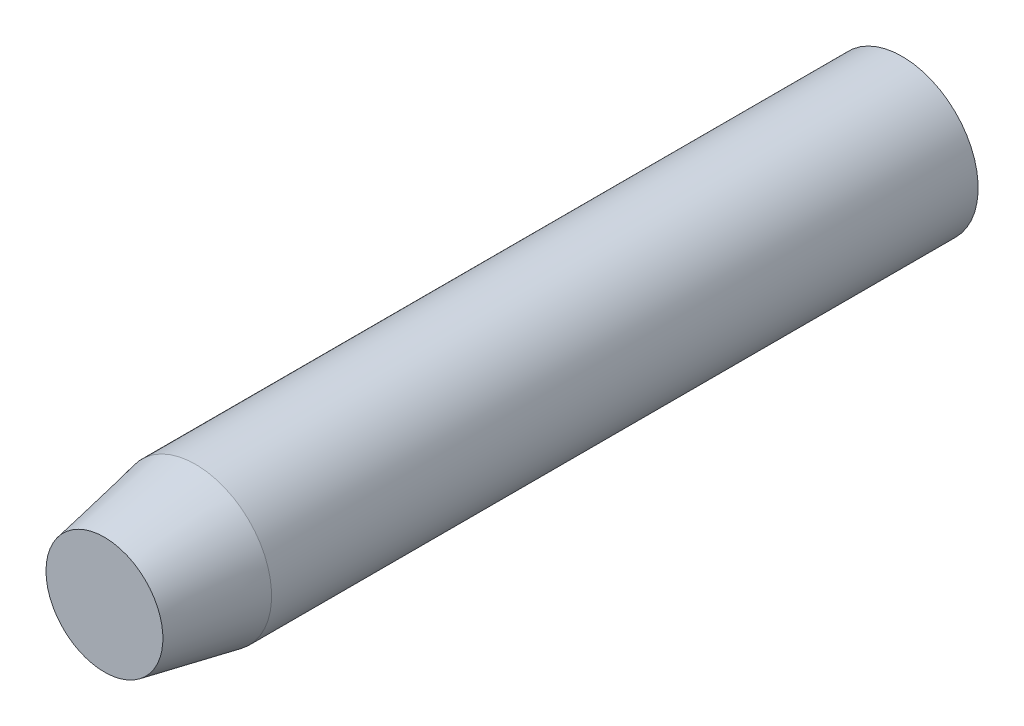
ISO-10303-21;
HEADER;
FILE_DESCRIPTION(('STEP AP214'),'2;1');
FILE_NAME('part.step','',(''),(''),'','','');
FILE_SCHEMA(('AUTOMOTIVE_DESIGN { 1 0 10303 214 1 1 1 1 }'));
ENDSEC;
DATA;
#1=APPLICATION_CONTEXT('core data for automotive mechanical design processes');
#2=APPLICATION_PROTOCOL_DEFINITION('international standard','automotive_design',2000,#1);
#3=PRODUCT_CONTEXT('',#1,'mechanical');
#4=PRODUCT('Part','Part','',(#3));
#5=PRODUCT_RELATED_PRODUCT_CATEGORY('part','',(#4));
#6=PRODUCT_DEFINITION_FORMATION('','',#4);
#7=PRODUCT_DEFINITION_CONTEXT('part definition',#1,'design');
#8=PRODUCT_DEFINITION('design','',#6,#7);
#9=PRODUCT_DEFINITION_SHAPE('','',#8);
#10=(LENGTH_UNIT() NAMED_UNIT(*) SI_UNIT(.MILLI.,.METRE.));
#11=(NAMED_UNIT(*) PLANE_ANGLE_UNIT() SI_UNIT($,.RADIAN.));
#12=(NAMED_UNIT(*) SI_UNIT($,.STERADIAN.) SOLID_ANGLE_UNIT());
#13=UNCERTAINTY_MEASURE_WITH_UNIT(LENGTH_MEASURE(1.E-05),#10,'distance_accuracy_value','');
#14=(GEOMETRIC_REPRESENTATION_CONTEXT(3) GLOBAL_UNCERTAINTY_ASSIGNED_CONTEXT((#13)) GLOBAL_UNIT_ASSIGNED_CONTEXT((#10,
#11,#12)) REPRESENTATION_CONTEXT('',''));
#15=CARTESIAN_POINT('',(0.,0.,0.));
#16=DIRECTION('',(0.,0.,1.));
#17=DIRECTION('',(1.,0.,0.));
#18=AXIS2_PLACEMENT_3D('',#15,#16,#17);
#19=CARTESIAN_POINT('',(-7.95,0.,-45.36875));
#20=DIRECTION('',(0.,0.,-1.));
#21=DIRECTION('',(-1.,0.,0.));
#22=AXIS2_PLACEMENT_3D('',#19,#20,#21);
#23=CYLINDRICAL_SURFACE('',#22,6.5);
#24=CARTESIAN_POINT('',(-7.94999999999999,0.,31.76875));
#25=DIRECTION('',(0.,0.,-1.));
#26=DIRECTION('',(-1.,0.,0.));
#27=AXIS2_PLACEMENT_3D('',#24,#25,#26);
#28=CIRCLE('',#27,6.5);
#29=CARTESIAN_POINT('',(-14.45,0.,31.76875));
#30=VERTEX_POINT('',#29);
#31=EDGE_CURVE('E10',#30,#30,#28,.T.);
#32=ORIENTED_EDGE('',*,*,#31,.T.);
#33=EDGE_LOOP('',(#32));
#34=FACE_BOUND('',#33,.T.);
#35=CARTESIAN_POINT('',(-7.95,0.,-28.68125));
#36=DIRECTION('',(0.,0.,-1.));
#37=DIRECTION('',(-1.,0.,0.));
#38=AXIS2_PLACEMENT_3D('',#35,#36,#37);
#39=CIRCLE('',#38,6.49999999999999);
#40=CARTESIAN_POINT('',(-14.45,0.,-28.68125));
#41=VERTEX_POINT('',#40);
#42=EDGE_CURVE('E52',#41,#41,#39,.T.);
#43=ORIENTED_EDGE('',*,*,#42,.F.);
#44=EDGE_LOOP('',(#43));
#45=FACE_BOUND('',#44,.T.);
#46=ADVANCED_FACE('F33',(#34,#45),#23,.T.);
#47=CARTESIAN_POINT('',(-7.94999999999999,0.,31.76875));
#48=DIRECTION('',(0.,0.,-1.));
#49=DIRECTION('',(-1.,0.,0.));
#50=AXIS2_PLACEMENT_3D('',#47,#48,#49);
#51=CONICAL_SURFACE('',#50,6.5,0.189988287918716);
#52=CARTESIAN_POINT('',(-7.94999999999999,0.,39.56875));
#53=DIRECTION('',(0.,0.,-1.));
#54=DIRECTION('',(-1.,0.,0.));
#55=AXIS2_PLACEMENT_3D('',#52,#53,#54);
#56=CIRCLE('',#55,5.);
#57=CARTESIAN_POINT('',(-12.95,0.,39.56875));
#58=VERTEX_POINT('',#57);
#59=EDGE_CURVE('E39',#58,#58,#56,.T.);
#60=ORIENTED_EDGE('',*,*,#59,.T.);
#61=EDGE_LOOP('',(#60));
#62=FACE_BOUND('',#61,.T.);
#63=ORIENTED_EDGE('',*,*,#31,.F.);
#64=EDGE_LOOP('',(#63));
#65=FACE_BOUND('',#64,.T.);
#66=ADVANCED_FACE('F60',(#62,#65),#51,.T.);
#67=CARTESIAN_POINT('',(-12.95,0.,39.56875));
#68=DIRECTION('',(0.,0.,1.));
#69=DIRECTION('',(1.,0.,0.));
#70=AXIS2_PLACEMENT_3D('',#67,#68,#69);
#71=PLANE('',#70);
#72=ORIENTED_EDGE('',*,*,#59,.F.);
#73=EDGE_LOOP('',(#72));
#74=FACE_BOUND('',#73,.T.);
#75=ADVANCED_FACE('F64',(#74),#71,.T.);
#76=CARTESIAN_POINT('',(-7.94999999999999,0.,32.0158815986255));
#77=DIRECTION('',(0.,0.,-1.));
#78=DIRECTION('',(-1.,0.,0.));
#79=AXIS2_PLACEMENT_3D('',#76,#77,#78);
#80=PLANE('',#79);
#81=CARTESIAN_POINT('',(-7.94999999999999,0.,32.0158815986254));
#82=DIRECTION('',(0.,0.,-1.));
#83=DIRECTION('',(-1.,0.,0.));
#84=AXIS2_PLACEMENT_3D('',#81,#82,#83);
#85=CIRCLE('',#84,3.09999999999999);
#86=CARTESIAN_POINT('',(-11.05,0.,32.0158815986254));
#87=VERTEX_POINT('',#86);
#88=EDGE_CURVE('E43',#87,#87,#85,.T.);
#89=ORIENTED_EDGE('',*,*,#88,.T.);
#90=EDGE_LOOP('',(#89));
#91=FACE_BOUND('',#90,.T.);
#92=ADVANCED_FACE('F68',(#91),#80,.T.);
#93=CARTESIAN_POINT('',(-7.95,0.,-45.36875));
#94=DIRECTION('',(0.,0.,-1.));
#95=DIRECTION('',(-1.,0.,0.));
#96=AXIS2_PLACEMENT_3D('',#93,#94,#95);
#97=CYLINDRICAL_SURFACE('',#96,3.09999999999999);
#98=CARTESIAN_POINT('',(-7.95,0.,-28.68125));
#99=DIRECTION('',(0.,0.,-1.));
#100=DIRECTION('',(-1.,0.,0.));
#101=AXIS2_PLACEMENT_3D('',#98,#99,#100);
#102=CIRCLE('',#101,3.09999999999999);
#103=CARTESIAN_POINT('',(-11.05,0.,-28.68125));
#104=VERTEX_POINT('',#103);
#105=EDGE_CURVE('E47',#104,#104,#102,.T.);
#106=ORIENTED_EDGE('',*,*,#105,.T.);
#107=EDGE_LOOP('',(#106));
#108=FACE_BOUND('',#107,.T.);
#109=ORIENTED_EDGE('',*,*,#88,.F.);
#110=EDGE_LOOP('',(#109));
#111=FACE_BOUND('',#110,.T.);
#112=ADVANCED_FACE('F75',(#108,#111),#97,.F.);
#113=CARTESIAN_POINT('',(-14.45,0.,-28.68125));
#114=DIRECTION('',(0.,0.,-1.));
#115=DIRECTION('',(-1.,0.,0.));
#116=AXIS2_PLACEMENT_3D('',#113,#114,#115);
#117=PLANE('',#116);
#118=ORIENTED_EDGE('',*,*,#42,.T.);
#119=EDGE_LOOP('',(#118));
#120=FACE_BOUND('',#119,.T.);
#121=ORIENTED_EDGE('',*,*,#105,.F.);
#122=EDGE_LOOP('',(#121));
#123=FACE_BOUND('',#122,.T.);
#124=ADVANCED_FACE('F56',(#120,#123),#117,.T.);
#125=CLOSED_SHELL('',(#46,#66,#75,#92,#112,#124));
#126=MANIFOLD_SOLID_BREP('B2',#125);
#127=ADVANCED_BREP_SHAPE_REPRESENTATION('',(#18,#126),#14);
#128=SHAPE_DEFINITION_REPRESENTATION(#9,#127);
ENDSEC;
END-ISO-10303-21;
